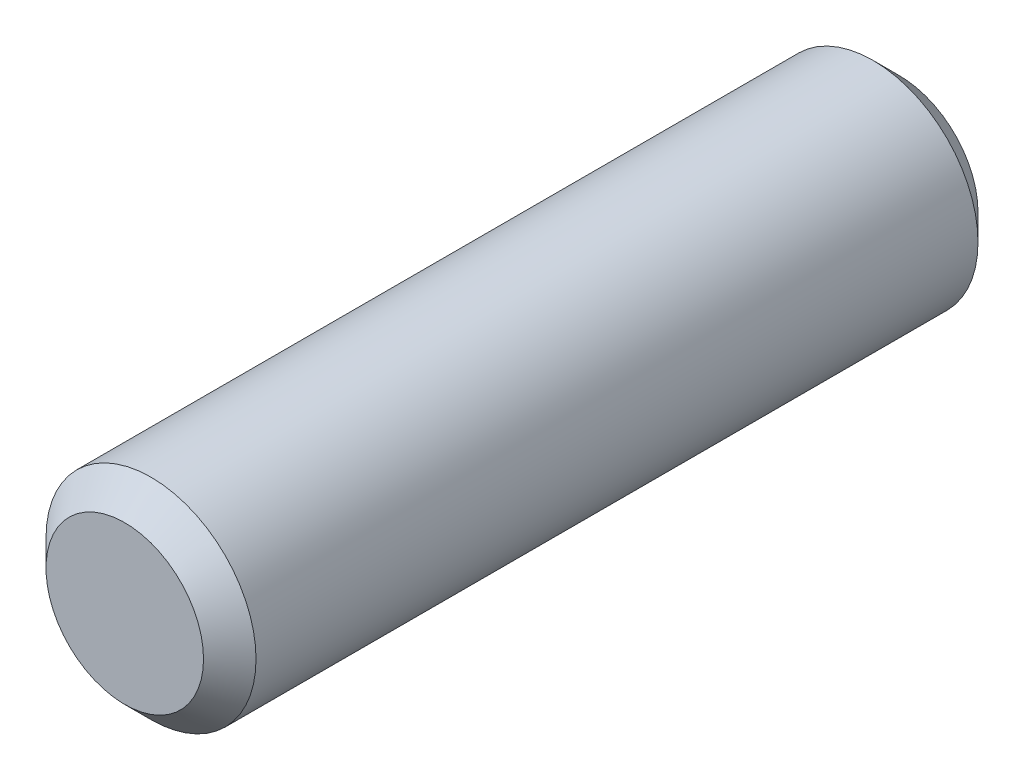
ISO-10303-21;
HEADER;
FILE_DESCRIPTION(('STEP AP214'),'2;1');
FILE_NAME('part.step','',(''),(''),'','','');
FILE_SCHEMA(('AUTOMOTIVE_DESIGN { 1 0 10303 214 1 1 1 1 }'));
ENDSEC;
DATA;
#1=APPLICATION_CONTEXT('core data for automotive mechanical design processes');
#2=APPLICATION_PROTOCOL_DEFINITION('international standard','automotive_design',2000,#1);
#3=PRODUCT_CONTEXT('',#1,'mechanical');
#4=PRODUCT('Part','Part','',(#3));
#5=PRODUCT_RELATED_PRODUCT_CATEGORY('part','',(#4));
#6=PRODUCT_DEFINITION_FORMATION('','',#4);
#7=PRODUCT_DEFINITION_CONTEXT('part definition',#1,'design');
#8=PRODUCT_DEFINITION('design','',#6,#7);
#9=PRODUCT_DEFINITION_SHAPE('','',#8);
#10=(LENGTH_UNIT() NAMED_UNIT(*) SI_UNIT(.MILLI.,.METRE.));
#11=(NAMED_UNIT(*) PLANE_ANGLE_UNIT() SI_UNIT($,.RADIAN.));
#12=(NAMED_UNIT(*) SI_UNIT($,.STERADIAN.) SOLID_ANGLE_UNIT());
#13=UNCERTAINTY_MEASURE_WITH_UNIT(LENGTH_MEASURE(1.E-05),#10,'distance_accuracy_value','');
#14=(GEOMETRIC_REPRESENTATION_CONTEXT(3) GLOBAL_UNCERTAINTY_ASSIGNED_CONTEXT((#13)) GLOBAL_UNIT_ASSIGNED_CONTEXT((#10,
#11,#12)) REPRESENTATION_CONTEXT('',''));
#15=CARTESIAN_POINT('',(0.,0.,0.));
#16=DIRECTION('',(0.,0.,1.));
#17=DIRECTION('',(1.,0.,0.));
#18=AXIS2_PLACEMENT_3D('',#15,#16,#17);
#19=CARTESIAN_POINT('',(0.,0.,14.75));
#20=DIRECTION('',(0.,0.,-1.));
#21=DIRECTION('',(-1.,0.,0.));
#22=AXIS2_PLACEMENT_3D('',#19,#20,#21);
#23=CYLINDRICAL_SURFACE('',#22,4.);
#24=CARTESIAN_POINT('',(0.,0.,-13.75));
#25=DIRECTION('',(0.,0.,1.));
#26=DIRECTION('',(1.,0.,0.));
#27=AXIS2_PLACEMENT_3D('',#24,#25,#26);
#28=CIRCLE('',#27,4.);
#29=CARTESIAN_POINT('',(4.,0.,-13.75));
#30=VERTEX_POINT('',#29);
#31=EDGE_CURVE('E42',#30,#30,#28,.T.);
#32=ORIENTED_EDGE('',*,*,#31,.T.);
#33=EDGE_LOOP('',(#32));
#34=FACE_BOUND('',#33,.T.);
#35=CARTESIAN_POINT('',(0.,0.,13.75));
#36=DIRECTION('',(0.,0.,1.));
#37=DIRECTION('',(1.,0.,0.));
#38=AXIS2_PLACEMENT_3D('',#35,#36,#37);
#39=CIRCLE('',#38,4.);
#40=CARTESIAN_POINT('',(4.,0.,13.75));
#41=VERTEX_POINT('',#40);
#42=EDGE_CURVE('E46',#41,#41,#39,.F.);
#43=ORIENTED_EDGE('',*,*,#42,.T.);
#44=EDGE_LOOP('',(#43));
#45=FACE_BOUND('',#44,.T.);
#46=ADVANCED_FACE('F31',(#34,#45),#23,.T.);
#47=CARTESIAN_POINT('',(0.,0.,14.75));
#48=DIRECTION('',(0.,0.,1.));
#49=DIRECTION('',(1.,0.,0.));
#50=AXIS2_PLACEMENT_3D('',#47,#48,#49);
#51=PLANE('',#50);
#52=CARTESIAN_POINT('',(0.,0.,14.75));
#53=DIRECTION('',(0.,0.,1.));
#54=DIRECTION('',(1.,0.,0.));
#55=AXIS2_PLACEMENT_3D('',#52,#53,#54);
#56=CIRCLE('',#55,3.);
#57=CARTESIAN_POINT('',(3.,0.,14.75));
#58=VERTEX_POINT('',#57);
#59=EDGE_CURVE('E10',#58,#58,#56,.T.);
#60=ORIENTED_EDGE('',*,*,#59,.T.);
#61=EDGE_LOOP('',(#60));
#62=FACE_BOUND('',#61,.T.);
#63=ADVANCED_FACE('F62',(#62),#51,.T.);
#64=CARTESIAN_POINT('',(0.,0.,-14.75));
#65=DIRECTION('',(0.,0.,1.));
#66=DIRECTION('',(1.,0.,0.));
#67=AXIS2_PLACEMENT_3D('',#64,#65,#66);
#68=PLANE('',#67);
#69=CARTESIAN_POINT('',(0.,0.,-14.75));
#70=DIRECTION('',(0.,0.,1.));
#71=DIRECTION('',(1.,0.,0.));
#72=AXIS2_PLACEMENT_3D('',#69,#70,#71);
#73=CIRCLE('',#72,3.);
#74=CARTESIAN_POINT('',(3.,0.,-14.75));
#75=VERTEX_POINT('',#74);
#76=EDGE_CURVE('E38',#75,#75,#73,.F.);
#77=ORIENTED_EDGE('',*,*,#76,.T.);
#78=EDGE_LOOP('',(#77));
#79=FACE_BOUND('',#78,.T.);
#80=ADVANCED_FACE('F59',(#79),#68,.F.);
#81=CARTESIAN_POINT('',(0.,0.,-13.75));
#82=DIRECTION('',(0.,0.,1.));
#83=DIRECTION('',(1.,0.,0.));
#84=AXIS2_PLACEMENT_3D('',#81,#82,#83);
#85=CONICAL_SURFACE('',#84,4.,0.78539816339745);
#86=ORIENTED_EDGE('',*,*,#76,.F.);
#87=EDGE_LOOP('',(#86));
#88=FACE_BOUND('',#87,.T.);
#89=ORIENTED_EDGE('',*,*,#31,.F.);
#90=EDGE_LOOP('',(#89));
#91=FACE_BOUND('',#90,.T.);
#92=ADVANCED_FACE('F55',(#88,#91),#85,.T.);
#93=CARTESIAN_POINT('',(0.,0.,14.75));
#94=DIRECTION('',(0.,0.,-1.));
#95=DIRECTION('',(-1.,0.,0.));
#96=AXIS2_PLACEMENT_3D('',#93,#94,#95);
#97=CONICAL_SURFACE('',#96,3.,0.785398163397447);
#98=ORIENTED_EDGE('',*,*,#42,.F.);
#99=EDGE_LOOP('',(#98));
#100=FACE_BOUND('',#99,.T.);
#101=ORIENTED_EDGE('',*,*,#59,.F.);
#102=EDGE_LOOP('',(#101));
#103=FACE_BOUND('',#102,.T.);
#104=ADVANCED_FACE('F33',(#100,#103),#97,.T.);
#105=CLOSED_SHELL('',(#46,#63,#80,#92,#104));
#106=MANIFOLD_SOLID_BREP('B2',#105);
#107=ADVANCED_BREP_SHAPE_REPRESENTATION('',(#18,#106),#14);
#108=SHAPE_DEFINITION_REPRESENTATION(#9,#107);
ENDSEC;
END-ISO-10303-21;
